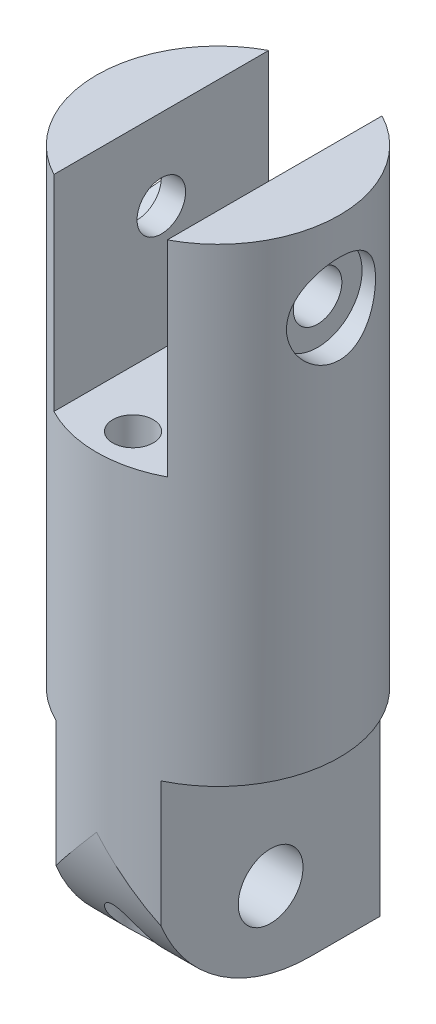
ISO-10303-21;
HEADER;
FILE_DESCRIPTION(('STEP AP214'),'2;1');
FILE_NAME('part.step','',(''),(''),'','','');
FILE_SCHEMA(('AUTOMOTIVE_DESIGN { 1 0 10303 214 1 1 1 1 }'));
ENDSEC;
DATA;
#1=APPLICATION_CONTEXT('core data for automotive mechanical design processes');
#2=APPLICATION_PROTOCOL_DEFINITION('international standard','automotive_design',2000,#1);
#3=PRODUCT_CONTEXT('',#1,'mechanical');
#4=PRODUCT('Part','Part','',(#3));
#5=PRODUCT_RELATED_PRODUCT_CATEGORY('part','',(#4));
#6=PRODUCT_DEFINITION_FORMATION('','',#4);
#7=PRODUCT_DEFINITION_CONTEXT('part definition',#1,'design');
#8=PRODUCT_DEFINITION('design','',#6,#7);
#9=PRODUCT_DEFINITION_SHAPE('','',#8);
#10=(LENGTH_UNIT() NAMED_UNIT(*) SI_UNIT(.MILLI.,.METRE.));
#11=(NAMED_UNIT(*) PLANE_ANGLE_UNIT() SI_UNIT($,.RADIAN.));
#12=(NAMED_UNIT(*) SI_UNIT($,.STERADIAN.) SOLID_ANGLE_UNIT());
#13=UNCERTAINTY_MEASURE_WITH_UNIT(LENGTH_MEASURE(1.E-05),#10,'distance_accuracy_value','');
#14=(GEOMETRIC_REPRESENTATION_CONTEXT(3) GLOBAL_UNCERTAINTY_ASSIGNED_CONTEXT((#13)) GLOBAL_UNIT_ASSIGNED_CONTEXT((#10,
#11,#12)) REPRESENTATION_CONTEXT('',''));
#15=CARTESIAN_POINT('',(0.,0.,0.));
#16=DIRECTION('',(0.,0.,1.));
#17=DIRECTION('',(1.,0.,0.));
#18=AXIS2_PLACEMENT_3D('',#15,#16,#17);
#19=CARTESIAN_POINT('',(3.25,7.,15.));
#20=DIRECTION('',(-1.,0.,0.));
#21=DIRECTION('',(0.,-1.,0.));
#22=AXIS2_PLACEMENT_3D('',#19,#20,#21);
#23=PLANE('',#22);
#24=CARTESIAN_POINT('',(3.25,-2.,7.5));
#25=DIRECTION('',(1.,0.,0.));
#26=DIRECTION('',(0.,1.,0.));
#27=AXIS2_PLACEMENT_3D('',#24,#25,#26);
#28=CIRCLE('',#27,2.);
#29=CARTESIAN_POINT('',(3.25,0.,7.5));
#30=VERTEX_POINT('',#29);
#31=EDGE_CURVE('E362',#30,#30,#28,.T.);
#32=ORIENTED_EDGE('',*,*,#31,.F.);
#33=EDGE_LOOP('',(#32));
#34=FACE_BOUND('',#33,.T.);
#35=DIRECTION('',(0.,1.,0.));
#36=VECTOR('',#35,1.);
#37=CARTESIAN_POINT('',(3.25,-7.,0.740747082702113));
#38=LINE('',#37,#36);
#39=CARTESIAN_POINT('',(3.25,-7.,0.740747082702113));
#40=VERTEX_POINT('',#39);
#41=CARTESIAN_POINT('',(3.25,7.,0.740747082702113));
#42=VERTEX_POINT('',#41);
#43=EDGE_CURVE('E241',#40,#42,#38,.T.);
#44=ORIENTED_EDGE('',*,*,#43,.T.);
#45=DIRECTION('',(0.,0.,-1.));
#46=VECTOR('',#45,1.);
#47=CARTESIAN_POINT('',(3.25,7.,15.));
#48=LINE('',#47,#46);
#49=CARTESIAN_POINT('',(3.25,7.,14.2592529172979));
#50=VERTEX_POINT('',#49);
#51=EDGE_CURVE('E380',#50,#42,#48,.T.);
#52=ORIENTED_EDGE('',*,*,#51,.F.);
#53=DIRECTION('',(0.,1.,0.));
#54=VECTOR('',#53,1.);
#55=CARTESIAN_POINT('',(3.25,-7.,14.2592529172979));
#56=LINE('',#55,#54);
#57=CARTESIAN_POINT('',(3.25,-0.777067038524808,14.2592529172979));
#58=VERTEX_POINT('',#57);
#59=EDGE_CURVE('E250',#58,#50,#56,.T.);
#60=ORIENTED_EDGE('',*,*,#59,.F.);
#61=CARTESIAN_POINT('',(3.25,3.,5.));
#62=DIRECTION('',(-1.,0.,0.));
#63=DIRECTION('',(0.,-1.,0.));
#64=AXIS2_PLACEMENT_3D('',#61,#62,#63);
#65=CIRCLE('',#64,10.);
#66=CARTESIAN_POINT('',(3.25,-7.,5.));
#67=VERTEX_POINT('',#66);
#68=EDGE_CURVE('E383',#58,#67,#65,.F.);
#69=ORIENTED_EDGE('',*,*,#68,.T.);
#70=DIRECTION('',(0.,0.,-1.));
#71=VECTOR('',#70,1.);
#72=CARTESIAN_POINT('',(3.25,-7.,15.));
#73=LINE('',#72,#71);
#74=EDGE_CURVE('E365',#67,#40,#73,.T.);
#75=ORIENTED_EDGE('',*,*,#74,.T.);
#76=EDGE_LOOP('',(#44,#52,#60,#69,#75));
#77=FACE_BOUND('',#76,.T.);
#78=ADVANCED_FACE('F69',(#34,#77),#23,.F.);
#79=CARTESIAN_POINT('',(-3.25,-7.,15.));
#80=DIRECTION('',(0.,1.,0.));
#81=DIRECTION('',(0.,0.,1.));
#82=AXIS2_PLACEMENT_3D('',#79,#80,#81);
#83=PLANE('',#82);
#84=CARTESIAN_POINT('',(0.,-7.,3.));
#85=DIRECTION('',(0.,-1.,0.));
#86=DIRECTION('',(0.,0.,-1.));
#87=AXIS2_PLACEMENT_3D('',#84,#85,#86);
#88=CIRCLE('',#87,1.25);
#89=CARTESIAN_POINT('',(0.,-7.,1.75));
#90=VERTEX_POINT('',#89);
#91=EDGE_CURVE('E650',#90,#90,#88,.T.);
#92=ORIENTED_EDGE('',*,*,#91,.F.);
#93=EDGE_LOOP('',(#92));
#94=FACE_BOUND('',#93,.T.);
#95=CARTESIAN_POINT('',(0.,-7.,7.5));
#96=DIRECTION('',(0.,1.,0.));
#97=DIRECTION('',(0.,0.,1.));
#98=AXIS2_PLACEMENT_3D('',#95,#96,#97);
#99=CIRCLE('',#98,7.5);
#100=CARTESIAN_POINT('',(-3.25,-7.,0.740747082702113));
#101=VERTEX_POINT('',#100);
#102=EDGE_CURVE('E251',#40,#101,#99,.T.);
#103=ORIENTED_EDGE('',*,*,#102,.F.);
#104=ORIENTED_EDGE('',*,*,#74,.F.);
#105=DIRECTION('',(1.,0.,0.));
#106=VECTOR('',#105,1.);
#107=CARTESIAN_POINT('',(-3.25,-7.,5.));
#108=LINE('',#107,#106);
#109=CARTESIAN_POINT('',(-3.25,-7.,5.));
#110=VERTEX_POINT('',#109);
#111=EDGE_CURVE('E385',#67,#110,#108,.F.);
#112=ORIENTED_EDGE('',*,*,#111,.T.);
#113=DIRECTION('',(0.,0.,-1.));
#114=VECTOR('',#113,1.);
#115=CARTESIAN_POINT('',(-3.25,-7.,15.));
#116=LINE('',#115,#114);
#117=EDGE_CURVE('E374',#110,#101,#116,.T.);
#118=ORIENTED_EDGE('',*,*,#117,.T.);
#119=EDGE_LOOP('',(#103,#104,#112,#118));
#120=FACE_BOUND('',#119,.T.);
#121=ADVANCED_FACE('F330',(#94,#120),#83,.F.);
#122=CARTESIAN_POINT('',(-3.25,7.,15.));
#123=DIRECTION('',(1.,0.,0.));
#124=DIRECTION('',(0.,1.,0.));
#125=AXIS2_PLACEMENT_3D('',#122,#123,#124);
#126=PLANE('',#125);
#127=CARTESIAN_POINT('',(-3.25,-2.,7.5));
#128=DIRECTION('',(1.,0.,0.));
#129=DIRECTION('',(0.,1.,0.));
#130=AXIS2_PLACEMENT_3D('',#127,#128,#129);
#131=CIRCLE('',#130,2.);
#132=CARTESIAN_POINT('',(-3.25,0.,7.5));
#133=VERTEX_POINT('',#132);
#134=EDGE_CURVE('E360',#133,#133,#131,.T.);
#135=ORIENTED_EDGE('',*,*,#134,.T.);
#136=EDGE_LOOP('',(#135));
#137=FACE_BOUND('',#136,.T.);
#138=CARTESIAN_POINT('',(-3.25,3.,5.));
#139=DIRECTION('',(1.,0.,0.));
#140=DIRECTION('',(0.,1.,0.));
#141=AXIS2_PLACEMENT_3D('',#138,#139,#140);
#142=CIRCLE('',#141,10.);
#143=CARTESIAN_POINT('',(-3.25,-0.777067038524727,14.2592529172979));
#144=VERTEX_POINT('',#143);
#145=EDGE_CURVE('E387',#110,#144,#142,.F.);
#146=ORIENTED_EDGE('',*,*,#145,.T.);
#147=DIRECTION('',(0.,1.,0.));
#148=VECTOR('',#147,1.);
#149=CARTESIAN_POINT('',(-3.25,-7.,14.2592529172979));
#150=LINE('',#149,#148);
#151=CARTESIAN_POINT('',(-3.25,7.,14.2592529172979));
#152=VERTEX_POINT('',#151);
#153=EDGE_CURVE('E239',#144,#152,#150,.T.);
#154=ORIENTED_EDGE('',*,*,#153,.T.);
#155=DIRECTION('',(0.,0.,-1.));
#156=VECTOR('',#155,1.);
#157=CARTESIAN_POINT('',(-3.25,7.,15.));
#158=LINE('',#157,#156);
#159=CARTESIAN_POINT('',(-3.25,7.,0.740747082702112));
#160=VERTEX_POINT('',#159);
#161=EDGE_CURVE('E377',#152,#160,#158,.T.);
#162=ORIENTED_EDGE('',*,*,#161,.T.);
#163=DIRECTION('',(0.,1.,0.));
#164=VECTOR('',#163,1.);
#165=CARTESIAN_POINT('',(-3.25,-7.,0.740747082702113));
#166=LINE('',#165,#164);
#167=EDGE_CURVE('E413',#101,#160,#166,.T.);
#168=ORIENTED_EDGE('',*,*,#167,.F.);
#169=ORIENTED_EDGE('',*,*,#117,.F.);
#170=EDGE_LOOP('',(#146,#154,#162,#168,#169));
#171=FACE_BOUND('',#170,.T.);
#172=ADVANCED_FACE('F335',(#137,#171),#126,.F.);
#173=CARTESIAN_POINT('',(0.,3.,5.));
#174=DIRECTION('',(-1.,0.,0.));
#175=DIRECTION('',(0.,0.,1.));
#176=AXIS2_PLACEMENT_3D('',#173,#174,#175);
#177=CYLINDRICAL_SURFACE('',#176,10.);
#178=CARTESIAN_POINT('',(0.,-4.60034588039679,11.4988262400479));
#179=CARTESIAN_POINT('',(0.0575288109608131,-4.60034633192946,11.4988256093035));
#180=CARTESIAN_POINT('',(0.11505399772144,-4.59693401826059,11.502822715136));
#181=CARTESIAN_POINT('',(0.22823665096081,-4.5834761227697,11.5185116248287));
#182=CARTESIAN_POINT('',(0.283893883210376,-4.57342971231711,11.5302043899131));
#183=CARTESIAN_POINT('',(0.391522903078539,-4.54727481070758,11.560414189299));
#184=CARTESIAN_POINT('',(0.443509328590721,-4.53119222670741,11.578902052222));
#185=CARTESIAN_POINT('',(0.542970946334787,-4.49367037095389,11.6216094500825));
#186=CARTESIAN_POINT('',(0.590444207603541,-4.47222882047104,11.6458314230352));
#187=CARTESIAN_POINT('',(0.693858382566063,-4.41754856445222,11.7068701017729));
#188=CARTESIAN_POINT('',(0.74800982895763,-4.38270365386441,11.7452795553846));
#189=CARTESIAN_POINT('',(0.847148183723735,-4.30681705487514,11.8274129335695));
#190=CARTESIAN_POINT('',(0.89211987702798,-4.26576527170702,11.8711454925512));
#191=CARTESIAN_POINT('',(0.987252420045894,-4.16367094789748,11.9777470851912));
#192=CARTESIAN_POINT('',(1.03375682534324,-4.10064843319519,12.0419724818224));
#193=CARTESIAN_POINT('',(1.11202550102491,-3.96841120618138,12.1728634669199));
#194=CARTESIAN_POINT('',(1.14376846925352,-3.89918771589937,12.2395324330415));
#195=CARTESIAN_POINT('',(1.20512691121574,-3.72575254744175,12.4015979723462));
#196=CARTESIAN_POINT('',(1.22801220853734,-3.61925054145639,12.4970726247963));
#197=CARTESIAN_POINT('',(1.25192625827192,-3.40072630611675,12.6845018482235));
#198=CARTESIAN_POINT('',(1.25290080853041,-3.28869107409675,12.7764471281507));
#199=CARTESIAN_POINT('',(1.2390160739484,-3.10025953801128,12.9243894094759));
#200=CARTESIAN_POINT('',(1.22941770428853,-3.02467078036612,12.9819973062648));
#201=CARTESIAN_POINT('',(1.20265869273446,-2.87271614168859,13.0944508219831));
#202=CARTESIAN_POINT('',(1.18549447992938,-2.79634991035228,13.1492951229198));
#203=CARTESIAN_POINT('',(1.14397630217485,-2.64352762751517,13.2558626611615));
#204=CARTESIAN_POINT('',(1.1196297934206,-2.56707175066068,13.3075890685247));
#205=CARTESIAN_POINT('',(1.0637867813495,-2.4146576671145,13.4077218470943));
#206=CARTESIAN_POINT('',(1.03229458006037,-2.33869918916016,13.4561301931831));
#207=CARTESIAN_POINT('',(0.959546911817907,-2.18327021358453,13.5523439188718));
#208=CARTESIAN_POINT('',(0.917797461428203,-2.10388405447856,13.5999146411363));
#209=CARTESIAN_POINT('',(0.824662482152894,-1.94813724713139,13.6904545809013));
#210=CARTESIAN_POINT('',(0.773285416874435,-1.87177401232619,13.7334277883316));
#211=CARTESIAN_POINT('',(0.676695759717014,-1.74841146843393,13.8009016608124));
#212=CARTESIAN_POINT('',(0.634678644034613,-1.69976793648386,13.8269441706631));
#213=CARTESIAN_POINT('',(0.543764619578198,-1.60733393640184,13.8755374312719));
#214=CARTESIAN_POINT('',(0.494882481116181,-1.56353340082824,13.8980954657454));
#215=CARTESIAN_POINT('',(0.410328609425263,-1.50057299344001,13.9300362657961));
#216=CARTESIAN_POINT('',(0.377364323238513,-1.47863442485303,13.9410472218018));
#217=CARTESIAN_POINT('',(0.308269866690451,-1.43908401630296,13.9607487164632));
#218=CARTESIAN_POINT('',(0.272144496533989,-1.42146576535685,13.9694426950006));
#219=CARTESIAN_POINT('',(0.204140015054733,-1.39500732552652,13.9824321515032));
#220=CARTESIAN_POINT('',(0.172770922493601,-1.38513258262856,13.9872509335304));
#221=CARTESIAN_POINT('',(0.10863906512088,-1.3702186469195,13.9945127413908));
#222=CARTESIAN_POINT('',(0.0758780804831299,-1.36517346082817,13.9969587118357));
#223=CARTESIAN_POINT('',(0.00971565662024547,-1.36049332526411,13.999228082882));
#224=CARTESIAN_POINT('',(-0.0236880276005255,-1.36088324321488,13.9990394291871));
#225=CARTESIAN_POINT('',(-0.0898697850396133,-1.36708221585887,13.9960326446625));
#226=CARTESIAN_POINT('',(-0.12264736944618,-1.37289534121178,13.9932125386644));
#227=CARTESIAN_POINT('',(-0.192498993484608,-1.39076317365085,13.9845039818664));
#228=CARTESIAN_POINT('',(-0.229268404492208,-1.40376175841571,13.9781502759771));
#229=CARTESIAN_POINT('',(-0.299995279155415,-1.43484740134685,13.9628359879126));
#230=CARTESIAN_POINT('',(-0.333946810007977,-1.45294485968761,13.9538700763329));
#231=CARTESIAN_POINT('',(-0.418925600500643,-1.50503533887645,13.9278178923304));
#232=CARTESIAN_POINT('',(-0.467632638347218,-1.54196424707584,13.909126433341));
#233=CARTESIAN_POINT('',(-0.558564300251688,-1.62136560507975,13.8682014347293));
#234=CARTESIAN_POINT('',(-0.600770050090257,-1.66385355695524,13.8459579501095));
#235=CARTESIAN_POINT('',(-0.678801636651221,-1.75107385940053,13.799413769684));
#236=CARTESIAN_POINT('',(-0.714760353406768,-1.79572378952148,13.7751782289425));
#237=CARTESIAN_POINT('',(-0.782368998157438,-1.88709197799037,13.724624021988));
#238=CARTESIAN_POINT('',(-0.814015009233281,-1.93381206615915,13.6983034959845));
#239=CARTESIAN_POINT('',(-0.873578262146656,-2.02867607236967,13.6438079702081));
#240=CARTESIAN_POINT('',(-0.901487844310031,-2.07682267540891,13.6156293325072));
#241=CARTESIAN_POINT('',(-0.953869165706419,-2.17399414365024,13.5576276254842));
#242=CARTESIAN_POINT('',(-0.978339944562463,-2.22301924990456,13.5278041000089));
#243=CARTESIAN_POINT('',(-1.03648457622005,-2.34837571239289,13.4500224067966));
#244=CARTESIAN_POINT('',(-1.06794492165718,-2.42508593896396,13.4010069487532));
#245=CARTESIAN_POINT('',(-1.12359720816828,-2.57896430130894,13.2996181391025));
#246=CARTESIAN_POINT('',(-1.14778503835172,-2.65613267101885,13.2472429085551));
#247=CARTESIAN_POINT('',(-1.18880186967856,-2.81020378415608,13.1394324196061));
#248=CARTESIAN_POINT('',(-1.2056368062501,-2.8871066919307,13.0839996701717));
#249=CARTESIAN_POINT('',(-1.23159320381571,-3.04008538662955,12.970348311449));
#250=CARTESIAN_POINT('',(-1.2407185329799,-3.11616156941276,12.912131114723));
#251=CARTESIAN_POINT('',(-1.25286792344638,-3.30085753472534,12.766499936122));
#252=CARTESIAN_POINT('',(-1.2513126972625,-3.40875200184953,12.6777134732531));
#253=CARTESIAN_POINT('',(-1.22772366104796,-3.61938148403095,12.4968619169247));
#254=CARTESIAN_POINT('',(-1.20573097558767,-3.72212642360836,12.4048037644697));
#255=CARTESIAN_POINT('',(-1.14743386723128,-3.8900628974733,12.2481774324844));
#256=CARTESIAN_POINT('',(-1.11731814138053,-3.95734634387134,12.1835632594184));
#257=CARTESIAN_POINT('',(-1.04332667285176,-4.0862124112587,12.0564668539613));
#258=CARTESIAN_POINT('',(-0.999468461074937,-4.14780216661484,11.9939820172111));
#259=CARTESIAN_POINT('',(-0.908823343821531,-4.24931724766382,11.8885005866831));
#260=CARTESIAN_POINT('',(-0.865205843162854,-4.2909138401453,11.8444000545688));
#261=CARTESIAN_POINT('',(-0.76883757221327,-4.36814251288804,11.7611894906291));
#262=CARTESIAN_POINT('',(-0.716098431613276,-4.40378207569116,11.7220732130628));
#263=CARTESIAN_POINT('',(-0.612245124736067,-4.46172352984542,11.657643266576));
#264=CARTESIAN_POINT('',(-0.562586109481275,-4.48527243298603,11.6311133106998));
#265=CARTESIAN_POINT('',(-0.458065299417217,-4.52641813587298,11.584375566612));
#266=CARTESIAN_POINT('',(-0.403206475147318,-4.54401830807232,11.5641641967587));
#267=CARTESIAN_POINT('',(-0.291201637526191,-4.57200141151039,11.5318637455773));
#268=CARTESIAN_POINT('',(-0.234168560095787,-4.58257937423715,11.5195555175503));
#269=CARTESIAN_POINT('',(-0.118088610350123,-4.59675024599106,11.5030383998551));
#270=CARTESIAN_POINT('',(-0.0590423964677331,-4.60034541698428,11.4988268873873));
#271=CARTESIAN_POINT('',(0.,-4.60034588039679,11.4988262400479));
#272=B_SPLINE_CURVE_WITH_KNOTS('',3,(#178,#179,#180,#181,#182,#183,#184,#185,#186,#187,#188,
#189,#190,#191,#192,#193,#194,#195,#196,#197,#198,#199,#200,#201,#202,#203,#204,#205,#206,#207,
#208,#209,#210,#211,#212,#213,#214,#215,#216,#217,#218,#219,#220,#221,#222,#223,#224,#225,#226,
#227,#228,#229,#230,#231,#232,#233,#234,#235,#236,#237,#238,#239,#240,#241,#242,#243,#244,#245,
#246,#247,#248,#249,#250,#251,#252,#253,#254,#255,#256,#257,#258,#259,#260,#261,#262,#263,#264,
#265,#266,#267,#268,#269,#270,#271),.UNSPECIFIED.,.T.,.F.,(4,2,2,2,2,2,2,2,2,2,2,2,2,2,2,2,2,2,
2,2,2,2,2,2,2,2,2,2,2,2,2,2,2,2,2,2,2,2,2,2,2,2,2,2,2,2,4),(0.,0.172348273756097,
0.344718078712481,0.516356381687259,0.688067792913604,0.911779782670741,1.13585960792365,
1.43805653794473,1.74068822377861,2.17289589147549,2.60617262432262,2.89241887086686,
3.17880036422053,3.46488559482381,3.75079904413221,4.05491767460736,4.35877019896172,
4.56645367834022,4.77369697735467,4.89669523302743,5.0195098500147,5.11882624455042,
5.21801923115933,5.31766620732977,5.41738803875374,5.53527045520422,5.65339507916606,
5.84407282185146,6.03529410095019,6.22174555510802,6.40836523689131,6.59536181455266,
6.78241051261683,7.07097917352888,7.35971064655029,7.64820861604563,7.93656175026965,
8.35438832069885,8.77137595038052,9.06454630970578,9.35734419210841,9.58060303576063,
9.80357930464446,9.98592361306855,10.1681643728299,10.3451044636672,10.5219872279666),.UNSPECIFIED.);
#273=CARTESIAN_POINT('',(0.,-4.60034588039679,11.4988262400479));
#274=VERTEX_POINT('',#273);
#275=EDGE_CURVE('E206',#274,#274,#272,.T.);
#276=ORIENTED_EDGE('',*,*,#275,.F.);
#277=EDGE_LOOP('',(#276));
#278=FACE_BOUND('',#277,.T.);
#279=CARTESIAN_POINT('',(-3.25,-0.777067038524808,14.2592529172979));
#280=CARTESIAN_POINT('',(-3.11964803441231,-0.623422022657622,14.3219224333858));
#281=CARTESIAN_POINT('',(-2.98826751006328,-0.469006401054278,14.3804577255213));
#282=CARTESIAN_POINT('',(-2.7237404145902,-0.158847919875885,14.4894004376096));
#283=CARTESIAN_POINT('',(-2.59059398915032,-0.00310517016124126,14.539808523586));
#284=CARTESIAN_POINT('',(-2.1888915842863,0.46585242207751,14.6790735815163));
#285=CARTESIAN_POINT('',(-1.91809052694975,0.78077536711749,14.7559627524007));
#286=CARTESIAN_POINT('',(-1.37572389886744,1.4099863558356,14.8779292423823));
#287=CARTESIAN_POINT('',(-1.10419730090432,1.72424533420997,14.9233371711216));
#288=CARTESIAN_POINT('',(-0.5594483269617,2.35399928323636,14.984120133363));
#289=CARTESIAN_POINT('',(-0.286226977240884,2.66949346995055,14.9995118431247));
#290=CARTESIAN_POINT('',(-0.00872869143398145,2.9899209752028,14.9999961890182));
#291=CARTESIAN_POINT('',(-0.00436433249316354,2.9949605028181,14.9999999984407));
#292=CARTESIAN_POINT('',(0.,3.,15.));
#293=B_SPLINE_CURVE_WITH_KNOTS('',3,(#279,#280,#281,#282,#283,#284,#285,#286,#287,#288,#289,
#290,#291,#292),.UNSPECIFIED.,.F.,.F.,(4,2,2,2,2,2,4),(0.,0.632933239584302,1.26581458397719,
2.53166454368447,3.78401078214235,5.03566104994836,5.05566105321367),.UNSPECIFIED.);
#294=CARTESIAN_POINT('',(0.,3.00000000000002,15.));
#295=VERTEX_POINT('',#294);
#296=EDGE_CURVE('E243',#144,#295,#293,.T.);
#297=ORIENTED_EDGE('',*,*,#296,.F.);
#298=ORIENTED_EDGE('',*,*,#145,.F.);
#299=ORIENTED_EDGE('',*,*,#111,.F.);
#300=ORIENTED_EDGE('',*,*,#68,.F.);
#301=CARTESIAN_POINT('',(3.25,-0.777067038524808,14.2592529172979));
#302=CARTESIAN_POINT('',(3.11964803441233,-0.623422022657608,14.3219224333858));
#303=CARTESIAN_POINT('',(2.9882675100633,-0.469006401054276,14.3804577255213));
#304=CARTESIAN_POINT('',(2.7237404145902,-0.158847919875907,14.4894004376096));
#305=CARTESIAN_POINT('',(2.59059398915031,-0.00310517016127368,14.539808523586));
#306=CARTESIAN_POINT('',(2.18889158428635,0.465852422077542,14.6790735815163));
#307=CARTESIAN_POINT('',(1.91809052694998,0.780775367117685,14.7559627524007));
#308=CARTESIAN_POINT('',(1.37572389886721,1.40998635583541,14.8779292423823));
#309=CARTESIAN_POINT('',(1.10419730090346,1.72424533420923,14.9233371711216));
#310=CARTESIAN_POINT('',(0.559448326962563,2.35399928323711,14.984120133363));
#311=CARTESIAN_POINT('',(0.286226977244101,2.66949346995334,14.9995118431247));
#312=CARTESIAN_POINT('',(0.00872869143408389,2.98992097520289,14.9999961890182));
#313=CARTESIAN_POINT('',(0.00436433249321547,2.99496050281815,14.9999999984407));
#314=CARTESIAN_POINT('',(0.,3.,15.));
#315=B_SPLINE_CURVE_WITH_KNOTS('',3,(#301,#302,#303,#304,#305,#306,#307,#308,#309,#310,#311,
#312,#313,#314),.UNSPECIFIED.,.F.,.F.,(4,2,2,2,2,2,4),(0.,0.632933239584291,1.26581458397717,
2.53166454368448,3.78401078214236,5.03566104994837,5.05566105321368),.UNSPECIFIED.);
#316=EDGE_CURVE('E263',#58,#295,#315,.T.);
#317=ORIENTED_EDGE('',*,*,#316,.T.);
#318=EDGE_LOOP('',(#297,#298,#299,#300,#317));
#319=FACE_BOUND('',#318,.T.);
#320=ADVANCED_FACE('F71',(#278,#319),#177,.T.);
#321=CARTESIAN_POINT('',(0.,36.,7.5));
#322=DIRECTION('',(0.,1.,0.));
#323=DIRECTION('',(0.,0.,1.));
#324=AXIS2_PLACEMENT_3D('',#321,#322,#323);
#325=PLANE('',#324);
#326=DIRECTION('',(0.,0.,1.));
#327=VECTOR('',#326,1.);
#328=CARTESIAN_POINT('',(-3.50000000000002,36.,7.5));
#329=LINE('',#328,#327);
#330=CARTESIAN_POINT('',(-3.50000000000002,36.,0.86675041928921));
#331=VERTEX_POINT('',#330);
#332=CARTESIAN_POINT('',(-3.50000000000002,36.,14.1332495807108));
#333=VERTEX_POINT('',#332);
#334=EDGE_CURVE('E391',#331,#333,#329,.T.);
#335=ORIENTED_EDGE('',*,*,#334,.F.);
#336=CARTESIAN_POINT('',(0.,36.,7.5));
#337=DIRECTION('',(0.,1.,0.));
#338=DIRECTION('',(0.,0.,1.));
#339=AXIS2_PLACEMENT_3D('',#336,#337,#338);
#340=CIRCLE('',#339,7.5);
#341=EDGE_CURVE('E368',#331,#333,#340,.T.);
#342=ORIENTED_EDGE('',*,*,#341,.T.);
#343=EDGE_LOOP('',(#335,#342));
#344=FACE_BOUND('',#343,.T.);
#345=ADVANCED_FACE('F346',(#344),#325,.T.);
#346=CARTESIAN_POINT('',(-3.25,-2.,7.5));
#347=DIRECTION('',(1.,0.,0.));
#348=DIRECTION('',(0.,1.,0.));
#349=AXIS2_PLACEMENT_3D('',#346,#347,#348);
#350=CYLINDRICAL_SURFACE('',#349,2.);
#351=ORIENTED_EDGE('',*,*,#134,.F.);
#352=EDGE_LOOP('',(#351));
#353=FACE_BOUND('',#352,.T.);
#354=ORIENTED_EDGE('',*,*,#31,.T.);
#355=EDGE_LOOP('',(#354));
#356=FACE_BOUND('',#355,.T.);
#357=ADVANCED_FACE('F343',(#353,#356),#350,.F.);
#358=CARTESIAN_POINT('',(0.,7.,7.5));
#359=DIRECTION('',(0.,1.,0.));
#360=DIRECTION('',(0.,0.,1.));
#361=AXIS2_PLACEMENT_3D('',#358,#359,#360);
#362=PLANE('',#361);
#363=CARTESIAN_POINT('',(0.,7.,7.5));
#364=DIRECTION('',(0.,1.,0.));
#365=DIRECTION('',(0.,0.,1.));
#366=AXIS2_PLACEMENT_3D('',#363,#364,#365);
#367=CIRCLE('',#366,7.5);
#368=EDGE_CURVE('E423',#50,#42,#367,.T.);
#369=ORIENTED_EDGE('',*,*,#368,.F.);
#370=ORIENTED_EDGE('',*,*,#51,.T.);
#371=EDGE_LOOP('',(#369,#370));
#372=FACE_BOUND('',#371,.T.);
#373=ADVANCED_FACE('F345',(#372),#362,.F.);
#374=CARTESIAN_POINT('',(0.,36.,7.5));
#375=DIRECTION('',(0.,-1.,0.));
#376=DIRECTION('',(0.,0.,-1.));
#377=AXIS2_PLACEMENT_3D('',#374,#375,#376);
#378=CYLINDRICAL_SURFACE('',#377,7.5);
#379=DIRECTION('',(0.,-1.,0.));
#380=VECTOR('',#379,1.);
#381=CARTESIAN_POINT('',(-6.75925291729789,36.,4.25000000000001));
#382=LINE('',#381,#380);
#383=CARTESIAN_POINT('',(-6.7592529172979,29.1236116251337,4.25000000000001));
#384=VERTEX_POINT('',#383);
#385=CARTESIAN_POINT('',(-6.75925291729789,32.8763883748663,4.25000000000001));
#386=VERTEX_POINT('',#385);
#387=EDGE_CURVE('E79',#384,#386,#382,.F.);
#388=ORIENTED_EDGE('',*,*,#387,.T.);
#389=CARTESIAN_POINT('',(0.,34.7527767497326,7.5));
#390=DIRECTION('',(0.,0.866025403784439,-0.499999999999999));
#391=DIRECTION('',(0.,-0.499999999999999,-0.866025403784439));
#392=AXIS2_PLACEMENT_3D('',#389,#390,#391);
#393=ELLIPSE('',#392,8.66025403784438,7.5);
#394=CARTESIAN_POINT('',(-7.5,34.7527767497326,7.5));
#395=VERTEX_POINT('',#394);
#396=EDGE_CURVE('E12',#386,#395,#393,.T.);
#397=ORIENTED_EDGE('',*,*,#396,.T.);
#398=CARTESIAN_POINT('',(0.,34.7527767497326,7.5));
#399=DIRECTION('',(0.,0.866025403784438,0.500000000000001));
#400=DIRECTION('',(0.,-0.500000000000001,0.866025403784438));
#401=AXIS2_PLACEMENT_3D('',#398,#399,#400);
#402=ELLIPSE('',#401,8.66025403784439,7.5);
#403=CARTESIAN_POINT('',(-6.75925291729789,32.8763883748663,10.75));
#404=VERTEX_POINT('',#403);
#405=EDGE_CURVE('E186',#395,#404,#402,.T.);
#406=ORIENTED_EDGE('',*,*,#405,.T.);
#407=DIRECTION('',(0.,-1.,0.));
#408=VECTOR('',#407,1.);
#409=CARTESIAN_POINT('',(-6.75925291729789,36.,10.75));
#410=LINE('',#409,#408);
#411=CARTESIAN_POINT('',(-6.75925291729789,29.1236116251337,10.75));
#412=VERTEX_POINT('',#411);
#413=EDGE_CURVE('E659',#404,#412,#410,.T.);
#414=ORIENTED_EDGE('',*,*,#413,.T.);
#415=CARTESIAN_POINT('',(0.,27.2472232502674,7.5));
#416=DIRECTION('',(0.,-0.866025403784439,0.5));
#417=DIRECTION('',(0.,-0.5,-0.866025403784439));
#418=AXIS2_PLACEMENT_3D('',#415,#416,#417);
#419=ELLIPSE('',#418,8.66025403784438,7.5);
#420=CARTESIAN_POINT('',(-7.5,27.2472232502674,7.5));
#421=VERTEX_POINT('',#420);
#422=EDGE_CURVE('E645',#412,#421,#419,.T.);
#423=ORIENTED_EDGE('',*,*,#422,.T.);
#424=CARTESIAN_POINT('',(0.,27.2472232502674,7.5));
#425=DIRECTION('',(0.,-0.866025403784439,-0.5));
#426=DIRECTION('',(0.,-0.5,0.866025403784439));
#427=AXIS2_PLACEMENT_3D('',#424,#425,#426);
#428=ELLIPSE('',#427,8.66025403784439,7.5);
#429=EDGE_CURVE('E642',#421,#384,#428,.T.);
#430=ORIENTED_EDGE('',*,*,#429,.T.);
#431=EDGE_LOOP('',(#388,#397,#406,#414,#423,#430));
#432=FACE_BOUND('',#431,.T.);
#433=CARTESIAN_POINT('',(7.5,28.25,7.5));
#434=CARTESIAN_POINT('',(7.50000312186943,28.2499957601559,7.64916340091462));
#435=CARTESIAN_POINT('',(7.49551083407196,28.2621745142851,7.79829715261848));
#436=CARTESIAN_POINT('',(7.47803771691332,28.3103807639427,8.09212061063863));
#437=CARTESIAN_POINT('',(7.46505769251259,28.3464059979212,8.23681073701748));
#438=CARTESIAN_POINT('',(7.43200599882739,28.4408685459559,8.51746784637523));
#439=CARTESIAN_POINT('',(7.41194764249896,28.4992638038986,8.65345064275875));
#440=CARTESIAN_POINT('',(7.36674725461798,28.6365998026205,8.91368339201445));
#441=CARTESIAN_POINT('',(7.34160392586795,28.7155457874537,9.03793033913379));
#442=CARTESIAN_POINT('',(7.28769120419502,28.8951165871431,9.2762429222357));
#443=CARTESIAN_POINT('',(7.25882233991119,28.9964330069993,9.38976472910907));
#444=CARTESIAN_POINT('',(7.20121334184221,29.2164002540435,9.59863947514447));
#445=CARTESIAN_POINT('',(7.17247324728629,29.335056036644,9.69398720232952));
#446=CARTESIAN_POINT('',(7.11723192199314,29.5915596285549,9.86719005872892));
#447=CARTESIAN_POINT('',(7.09084889561058,29.7299454567554,9.94428985961204));
#448=CARTESIAN_POINT('',(7.04484932142569,30.0188406266334,10.0738807153727));
#449=CARTESIAN_POINT('',(7.02523020673632,30.1693453424172,10.126381108384));
#450=CARTESIAN_POINT('',(6.99603990329749,30.4719588814006,10.2031578776842));
#451=CARTESIAN_POINT('',(6.98610194555094,30.6237687440343,10.2284685676662));
#452=CARTESIAN_POINT('',(6.97632326042149,30.929781189296,10.2533816996786));
#453=CARTESIAN_POINT('',(6.97647859485257,31.0839828152304,10.2529941686023));
#454=CARTESIAN_POINT('',(6.98655161563675,31.3810789225906,10.2273152463416));
#455=CARTESIAN_POINT('',(6.99591416236741,31.5241180714193,10.2034399938661));
#456=CARTESIAN_POINT('',(7.02242705549906,31.8039973045031,10.1337980138));
#457=CARTESIAN_POINT('',(7.03957852258203,31.9408364935813,10.088028135926));
#458=CARTESIAN_POINT('',(7.08008337610026,32.2073857915592,9.97508832183277));
#459=CARTESIAN_POINT('',(7.10354498086313,32.3369185940038,9.90754043957437));
#460=CARTESIAN_POINT('',(7.15398860670264,32.5832293506763,9.75322516181072));
#461=CARTESIAN_POINT('',(7.18097180350953,32.7000030210703,9.66645134069005));
#462=CARTESIAN_POINT('',(7.23752687525343,32.9253454837079,9.46960155284458));
#463=CARTESIAN_POINT('',(7.26715387777086,33.032910199767,9.35838932735392));
#464=CARTESIAN_POINT('',(7.32416772152515,33.2281537541427,9.11915779399269));
#465=CARTESIAN_POINT('',(7.3515542477326,33.3158297990106,8.99113612914646));
#466=CARTESIAN_POINT('',(7.40150404263883,33.469849921192,8.71944943250202));
#467=CARTESIAN_POINT('',(7.42399328235867,33.5358733353786,8.57558804380358));
#468=CARTESIAN_POINT('',(7.46106828194135,33.6424524315738,8.27777168193606));
#469=CARTESIAN_POINT('',(7.47565739110895,33.6830189073552,8.12382101725383));
#470=CARTESIAN_POINT('',(7.49470661210037,33.7356341007007,7.81865715690413));
#471=CARTESIAN_POINT('',(7.49964681722227,33.7490358318725,7.66770697278252));
#472=CARTESIAN_POINT('',(7.50031608885126,33.7508630018728,7.36565203255629));
#473=CARTESIAN_POINT('',(7.49604709187873,33.7392936916369,7.21454731562548));
#474=CARTESIAN_POINT('',(7.47909471176213,33.6925452079771,6.92222898460096));
#475=CARTESIAN_POINT('',(7.46672323625137,33.6582406720004,6.7808555379685));
#476=CARTESIAN_POINT('',(7.43512235809386,33.5681349472647,6.50596090832168));
#477=CARTESIAN_POINT('',(7.41589206317618,33.5123309615443,6.37244074958353));
#478=CARTESIAN_POINT('',(7.3717934654489,33.3790539116285,6.11272893005816));
#479=CARTESIAN_POINT('',(7.34677844528394,33.301001869951,5.98686004951381));
#480=CARTESIAN_POINT('',(7.29389308718916,33.1261036082178,5.74959324541106));
#481=CARTESIAN_POINT('',(7.26602173076095,33.0292506731475,5.63820051602461));
#482=CARTESIAN_POINT('',(7.20858443222809,32.813177374235,5.42659777286201));
#483=CARTESIAN_POINT('',(7.17901017230758,32.6930149402375,5.32734951094925));
#484=CARTESIAN_POINT('',(7.12301420495134,32.4371450050785,5.15025082554627));
#485=CARTESIAN_POINT('',(7.09659271654603,32.3014364251721,5.07240188822809));
#486=CARTESIAN_POINT('',(7.05004267507774,32.0174626284658,4.94034362890839));
#487=CARTESIAN_POINT('',(7.02993081583834,31.8691653988561,4.88619687043256));
#488=CARTESIAN_POINT('',(6.99881623412452,31.564621151899,4.80397675168701));
#489=CARTESIAN_POINT('',(6.98780821140261,31.4083788165147,4.77588821917411));
#490=CARTESIAN_POINT('',(6.97683139543633,31.1027486399612,4.74790483037546));
#491=CARTESIAN_POINT('',(6.97622414135252,30.9535317080346,4.74637927832575));
#492=CARTESIAN_POINT('',(6.98449276936025,30.6570884497829,4.76742136880885));
#493=CARTESIAN_POINT('',(6.99336783146823,30.5098619524497,4.789986928062));
#494=CARTESIAN_POINT('',(7.01908063198066,30.225730914034,4.85732302895733));
#495=CARTESIAN_POINT('',(7.03568945153917,30.0886530299248,4.90145689764079));
#496=CARTESIAN_POINT('',(7.0748745278557,29.8237608470382,5.01012643456598));
#497=CARTESIAN_POINT('',(7.09745226019147,29.695948848854,5.07466714836784));
#498=CARTESIAN_POINT('',(7.14745651289183,29.446173516875,5.22612146257841));
#499=CARTESIAN_POINT('',(7.17507087475862,29.3248355716804,5.31400373788159));
#500=CARTESIAN_POINT('',(7.23136315938062,29.0981067555171,5.50811900047636));
#501=CARTESIAN_POINT('',(7.26004141030265,28.9927208569003,5.61435768756782));
#502=CARTESIAN_POINT('',(7.31698041886032,28.7954400202964,5.84862840053257));
#503=CARTESIAN_POINT('',(7.34514593066589,28.7045025963147,5.97749345971985));
#504=CARTESIAN_POINT('',(7.39633669940812,28.5456226545033,6.24965784854994));
#505=CARTESIAN_POINT('',(7.41936193536523,28.4776802305249,6.39295723710164));
#506=CARTESIAN_POINT('',(7.45811714803401,28.3658300233738,6.69376598407588));
#507=CARTESIAN_POINT('',(7.4736521370045,28.3225597743705,6.85153953395494));
#508=CARTESIAN_POINT('',(7.49458959004745,28.2646534781244,7.17288901781912));
#509=CARTESIAN_POINT('',(7.4999965772887,28.2500046484207,7.336462328356));
#510=CARTESIAN_POINT('',(7.5,28.25,7.5));
#511=B_SPLINE_CURVE_WITH_KNOTS('',3,(#433,#434,#435,#436,#437,#438,#439,#440,#441,#442,#443,
#444,#445,#446,#447,#448,#449,#450,#451,#452,#453,#454,#455,#456,#457,#458,#459,#460,#461,#462,
#463,#464,#465,#466,#467,#468,#469,#470,#471,#472,#473,#474,#475,#476,#477,#478,#479,#480,#481,
#482,#483,#484,#485,#486,#487,#488,#489,#490,#491,#492,#493,#494,#495,#496,#497,#498,#499,#500,
#501,#502,#503,#504,#505,#506,#507,#508,#509,#510),.UNSPECIFIED.,.T.,.F.,(4,2,2,2,2,2,2,2,2,2,2,
2,2,2,2,2,2,2,2,2,2,2,2,2,2,2,2,2,2,2,2,2,2,2,2,2,2,2,4),(0.,0.446887269349349,
0.893732162923371,1.33974106914939,1.7858638979375,2.24842473965862,2.71111803601497,
3.19050672893151,3.6697132943022,4.12996375453753,4.59003463599781,5.02396705194619,
5.45796192255757,5.89993527296308,6.34205656133037,6.81248619551747,7.28298186270095,
7.76015995462979,8.23713558552159,8.68970480563612,9.14217886831116,9.57818454876607,
10.0142469703521,10.462896209775,10.9117059866708,11.385386450699,11.8590998032843,
12.3340561236824,12.80873572978,13.254164536792,13.6995548284528,14.13252653843,
14.5656053837986,15.020648736522,15.4758336382825,15.9541458857872,16.4324600854427,
16.9226310274791,17.4125830067758),.UNSPECIFIED.);
#512=CARTESIAN_POINT('',(7.5,28.25,7.5));
#513=VERTEX_POINT('',#512);
#514=EDGE_CURVE('E275',#513,#513,#511,.T.);
#515=ORIENTED_EDGE('',*,*,#514,.T.);
#516=EDGE_LOOP('',(#515));
#517=FACE_BOUND('',#516,.T.);
#518=DIRECTION('',(0.,-1.,0.));
#519=VECTOR('',#518,1.);
#520=CARTESIAN_POINT('',(3.50000000000002,36.,14.1332495807108));
#521=LINE('',#520,#519);
#522=CARTESIAN_POINT('',(3.50000000000002,36.,14.1332495807108));
#523=VERTEX_POINT('',#522);
#524=CARTESIAN_POINT('',(3.49999999999998,23.32,14.1332495807108));
#525=VERTEX_POINT('',#524);
#526=EDGE_CURVE('E95',#523,#525,#521,.T.);
#527=ORIENTED_EDGE('',*,*,#526,.T.);
#528=CARTESIAN_POINT('',(0.,23.32,7.5));
#529=DIRECTION('',(0.,-1.,0.));
#530=DIRECTION('',(0.,0.,-1.));
#531=AXIS2_PLACEMENT_3D('',#528,#529,#530);
#532=CIRCLE('',#531,7.5);
#533=CARTESIAN_POINT('',(-3.50000000000002,23.32,14.1332495807108));
#534=VERTEX_POINT('',#533);
#535=EDGE_CURVE('E270',#525,#534,#532,.T.);
#536=ORIENTED_EDGE('',*,*,#535,.T.);
#537=DIRECTION('',(0.,-1.,0.));
#538=VECTOR('',#537,1.);
#539=CARTESIAN_POINT('',(-3.50000000000002,36.,14.1332495807108));
#540=LINE('',#539,#538);
#541=EDGE_CURVE('E402',#534,#333,#540,.F.);
#542=ORIENTED_EDGE('',*,*,#541,.T.);
#543=ORIENTED_EDGE('',*,*,#341,.F.);
#544=DIRECTION('',(0.,-1.,0.));
#545=VECTOR('',#544,1.);
#546=CARTESIAN_POINT('',(-3.50000000000002,36.,0.866750419289211));
#547=LINE('',#546,#545);
#548=CARTESIAN_POINT('',(-3.50000000000002,23.32,0.866750419289211));
#549=VERTEX_POINT('',#548);
#550=EDGE_CURVE('E421',#331,#549,#547,.T.);
#551=ORIENTED_EDGE('',*,*,#550,.T.);
#552=CARTESIAN_POINT('',(3.49999999999998,23.32,0.86675041928921));
#553=VERTEX_POINT('',#552);
#554=EDGE_CURVE('E271',#549,#553,#532,.T.);
#555=ORIENTED_EDGE('',*,*,#554,.T.);
#556=DIRECTION('',(0.,-1.,0.));
#557=VECTOR('',#556,1.);
#558=CARTESIAN_POINT('',(3.50000000000002,36.,0.866750419289211));
#559=LINE('',#558,#557);
#560=CARTESIAN_POINT('',(3.50000000000002,36.,0.86675041928921));
#561=VERTEX_POINT('',#560);
#562=EDGE_CURVE('E412',#553,#561,#559,.F.);
#563=ORIENTED_EDGE('',*,*,#562,.T.);
#564=EDGE_CURVE('E363',#523,#561,#340,.T.);
#565=ORIENTED_EDGE('',*,*,#564,.F.);
#566=EDGE_LOOP('',(#527,#536,#542,#543,#551,#555,#563,#565));
#567=FACE_BOUND('',#566,.T.);
#568=EDGE_CURVE('E422',#160,#152,#367,.T.);
#569=ORIENTED_EDGE('',*,*,#568,.T.);
#570=ORIENTED_EDGE('',*,*,#153,.F.);
#571=ORIENTED_EDGE('',*,*,#296,.T.);
#572=ORIENTED_EDGE('',*,*,#316,.F.);
#573=ORIENTED_EDGE('',*,*,#59,.T.);
#574=ORIENTED_EDGE('',*,*,#368,.T.);
#575=ORIENTED_EDGE('',*,*,#43,.F.);
#576=ORIENTED_EDGE('',*,*,#102,.T.);
#577=ORIENTED_EDGE('',*,*,#167,.T.);
#578=EDGE_LOOP('',(#569,#570,#571,#572,#573,#574,#575,#576,#577));
#579=FACE_BOUND('',#578,.T.);
#580=ADVANCED_FACE('F284',(#432,#517,#567,#579),#378,.T.);
#581=DIRECTION('',(0.,0.,-1.));
#582=VECTOR('',#581,1.);
#583=CARTESIAN_POINT('',(3.50000000000002,36.,7.5));
#584=LINE('',#583,#582);
#585=EDGE_CURVE('E390',#523,#561,#584,.T.);
#586=ORIENTED_EDGE('',*,*,#585,.F.);
#587=ORIENTED_EDGE('',*,*,#564,.T.);
#588=EDGE_LOOP('',(#586,#587));
#589=FACE_BOUND('',#588,.T.);
#590=ADVANCED_FACE('F356',(#589),#325,.T.);
#591=ORIENTED_EDGE('',*,*,#161,.F.);
#592=ORIENTED_EDGE('',*,*,#568,.F.);
#593=EDGE_LOOP('',(#591,#592));
#594=FACE_BOUND('',#593,.T.);
#595=ADVANCED_FACE('F353',(#594),#362,.F.);
#596=CARTESIAN_POINT('',(-3.50000000000002,23.32,15.));
#597=DIRECTION('',(0.,-1.,0.));
#598=DIRECTION('',(0.,0.,-1.));
#599=AXIS2_PLACEMENT_3D('',#596,#597,#598);
#600=PLANE('',#599);
#601=CARTESIAN_POINT('',(0.,23.32,12.7488262400479));
#602=DIRECTION('',(0.,-1.,0.));
#603=DIRECTION('',(0.,0.,-1.));
#604=AXIS2_PLACEMENT_3D('',#601,#602,#603);
#605=CIRCLE('',#604,1.25);
#606=CARTESIAN_POINT('',(0.,23.32,11.4988262400479));
#607=VERTEX_POINT('',#606);
#608=EDGE_CURVE('E74',#607,#607,#605,.T.);
#609=ORIENTED_EDGE('',*,*,#608,.T.);
#610=EDGE_LOOP('',(#609));
#611=FACE_BOUND('',#610,.T.);
#612=CARTESIAN_POINT('',(0.,23.32,3.));
#613=DIRECTION('',(0.,-1.,0.));
#614=DIRECTION('',(0.,0.,-1.));
#615=AXIS2_PLACEMENT_3D('',#612,#613,#614);
#616=CIRCLE('',#615,1.25);
#617=CARTESIAN_POINT('',(0.,23.32,1.75));
#618=VERTEX_POINT('',#617);
#619=EDGE_CURVE('E648',#618,#618,#616,.T.);
#620=ORIENTED_EDGE('',*,*,#619,.T.);
#621=EDGE_LOOP('',(#620));
#622=FACE_BOUND('',#621,.T.);
#623=DIRECTION('',(0.,0.,-1.));
#624=VECTOR('',#623,1.);
#625=CARTESIAN_POINT('',(3.49999999999998,23.32,15.));
#626=LINE('',#625,#624);
#627=EDGE_CURVE('E408',#525,#553,#626,.T.);
#628=ORIENTED_EDGE('',*,*,#627,.T.);
#629=ORIENTED_EDGE('',*,*,#554,.F.);
#630=DIRECTION('',(0.,0.,-1.));
#631=VECTOR('',#630,1.);
#632=CARTESIAN_POINT('',(-3.50000000000002,23.32,15.));
#633=LINE('',#632,#631);
#634=EDGE_CURVE('E410',#534,#549,#633,.T.);
#635=ORIENTED_EDGE('',*,*,#634,.F.);
#636=ORIENTED_EDGE('',*,*,#535,.F.);
#637=EDGE_LOOP('',(#628,#629,#635,#636));
#638=FACE_BOUND('',#637,.T.);
#639=ADVANCED_FACE('F260',(#611,#622,#638),#600,.F.);
#640=CARTESIAN_POINT('',(-3.50000000000002,36.,15.));
#641=DIRECTION('',(-1.,0.,0.));
#642=DIRECTION('',(0.,-1.,0.));
#643=AXIS2_PLACEMENT_3D('',#640,#641,#642);
#644=PLANE('',#643);
#645=CARTESIAN_POINT('',(-3.50000000000002,31.,7.5));
#646=DIRECTION('',(-1.,0.,0.));
#647=DIRECTION('',(0.,-1.,0.));
#648=AXIS2_PLACEMENT_3D('',#645,#646,#647);
#649=CIRCLE('',#648,1.5);
#650=CARTESIAN_POINT('',(-3.50000000000002,29.5,7.5));
#651=VERTEX_POINT('',#650);
#652=EDGE_CURVE('E236',#651,#651,#649,.T.);
#653=ORIENTED_EDGE('',*,*,#652,.T.);
#654=EDGE_LOOP('',(#653));
#655=FACE_BOUND('',#654,.T.);
#656=ORIENTED_EDGE('',*,*,#334,.T.);
#657=ORIENTED_EDGE('',*,*,#541,.F.);
#658=ORIENTED_EDGE('',*,*,#634,.T.);
#659=ORIENTED_EDGE('',*,*,#550,.F.);
#660=EDGE_LOOP('',(#656,#657,#658,#659));
#661=FACE_BOUND('',#660,.T.);
#662=ADVANCED_FACE('F448',(#655,#661),#644,.F.);
#663=CARTESIAN_POINT('',(3.50000000000002,36.,15.));
#664=DIRECTION('',(1.,0.,0.));
#665=DIRECTION('',(0.,1.,0.));
#666=AXIS2_PLACEMENT_3D('',#663,#664,#665);
#667=PLANE('',#666);
#668=CARTESIAN_POINT('',(3.5,31.,7.5));
#669=DIRECTION('',(1.,0.,0.));
#670=DIRECTION('',(0.,1.,0.));
#671=AXIS2_PLACEMENT_3D('',#668,#669,#670);
#672=CIRCLE('',#671,1.5);
#673=CARTESIAN_POINT('',(3.50000000000001,32.5,7.5));
#674=VERTEX_POINT('',#673);
#675=EDGE_CURVE('E240',#674,#674,#672,.T.);
#676=ORIENTED_EDGE('',*,*,#675,.T.);
#677=EDGE_LOOP('',(#676));
#678=FACE_BOUND('',#677,.T.);
#679=ORIENTED_EDGE('',*,*,#585,.T.);
#680=ORIENTED_EDGE('',*,*,#562,.F.);
#681=ORIENTED_EDGE('',*,*,#627,.F.);
#682=ORIENTED_EDGE('',*,*,#526,.F.);
#683=EDGE_LOOP('',(#679,#680,#681,#682));
#684=FACE_BOUND('',#683,.T.);
#685=ADVANCED_FACE('F411',(#678,#684),#667,.F.);
#686=CARTESIAN_POINT('',(-24.5,31.,7.5));
#687=DIRECTION('',(1.,0.,0.));
#688=DIRECTION('',(0.,1.,0.));
#689=AXIS2_PLACEMENT_3D('',#686,#687,#688);
#690=CYLINDRICAL_SURFACE('',#689,1.5);
#691=CARTESIAN_POINT('',(6.14999999999992,31.,7.5));
#692=DIRECTION('',(-1.,0.,0.));
#693=DIRECTION('',(0.,-1.,0.));
#694=AXIS2_PLACEMENT_3D('',#691,#692,#693);
#695=CIRCLE('',#694,1.5);
#696=CARTESIAN_POINT('',(6.14999999999992,29.5,7.5));
#697=VERTEX_POINT('',#696);
#698=EDGE_CURVE('E235',#697,#697,#695,.F.);
#699=ORIENTED_EDGE('',*,*,#698,.T.);
#700=EDGE_LOOP('',(#699));
#701=FACE_BOUND('',#700,.T.);
#702=ORIENTED_EDGE('',*,*,#675,.F.);
#703=EDGE_LOOP('',(#702));
#704=FACE_BOUND('',#703,.T.);
#705=ADVANCED_FACE('F455',(#701,#704),#690,.F.);
#706=CARTESIAN_POINT('',(-5.00000000000002,31.,7.5));
#707=DIRECTION('',(1.,0.,0.));
#708=DIRECTION('',(0.,0.,-1.));
#709=AXIS2_PLACEMENT_3D('',#706,#707,#708);
#710=CIRCLE('',#709,1.5);
#711=CARTESIAN_POINT('',(-5.00000000000002,31.,6.));
#712=VERTEX_POINT('',#711);
#713=EDGE_CURVE('E224',#712,#712,#710,.F.);
#714=ORIENTED_EDGE('',*,*,#713,.T.);
#715=EDGE_LOOP('',(#714));
#716=FACE_BOUND('',#715,.T.);
#717=ORIENTED_EDGE('',*,*,#652,.F.);
#718=EDGE_LOOP('',(#717));
#719=FACE_BOUND('',#718,.T.);
#720=ADVANCED_FACE('F256',(#716,#719),#690,.F.);
#721=CARTESIAN_POINT('',(16.1499999999999,31.,7.5));
#722=DIRECTION('',(-1.,0.,0.));
#723=DIRECTION('',(0.,-1.,0.));
#724=AXIS2_PLACEMENT_3D('',#721,#722,#723);
#725=CYLINDRICAL_SURFACE('',#724,2.75);
#726=CARTESIAN_POINT('',(6.14999999999992,31.,7.5));
#727=DIRECTION('',(-1.,0.,0.));
#728=DIRECTION('',(0.,-1.,0.));
#729=AXIS2_PLACEMENT_3D('',#726,#727,#728);
#730=CIRCLE('',#729,2.75);
#731=CARTESIAN_POINT('',(6.14999999999992,28.25,7.5));
#732=VERTEX_POINT('',#731);
#733=EDGE_CURVE('E232',#732,#732,#730,.T.);
#734=ORIENTED_EDGE('',*,*,#733,.T.);
#735=EDGE_LOOP('',(#734));
#736=FACE_BOUND('',#735,.T.);
#737=ORIENTED_EDGE('',*,*,#514,.F.);
#738=EDGE_LOOP('',(#737));
#739=FACE_BOUND('',#738,.T.);
#740=ADVANCED_FACE('F288',(#736,#739),#725,.F.);
#741=CARTESIAN_POINT('',(6.14999999999992,31.,7.5));
#742=DIRECTION('',(-1.,0.,0.));
#743=DIRECTION('',(0.,-1.,0.));
#744=AXIS2_PLACEMENT_3D('',#741,#742,#743);
#745=PLANE('',#744);
#746=ORIENTED_EDGE('',*,*,#733,.F.);
#747=EDGE_LOOP('',(#746));
#748=FACE_BOUND('',#747,.T.);
#749=ORIENTED_EDGE('',*,*,#698,.F.);
#750=EDGE_LOOP('',(#749));
#751=FACE_BOUND('',#750,.T.);
#752=ADVANCED_FACE('F292',(#748,#751),#745,.F.);
#753=CARTESIAN_POINT('',(-15.,32.8763883748663,4.25000000000001));
#754=DIRECTION('',(0.,0.866025403784439,-0.499999999999999));
#755=DIRECTION('',(0.,0.499999999999999,0.866025403784439));
#756=AXIS2_PLACEMENT_3D('',#753,#754,#755);
#757=PLANE('',#756);
#758=DIRECTION('',(1.,0.,0.));
#759=VECTOR('',#758,1.);
#760=CARTESIAN_POINT('',(-15.,32.8763883748663,4.25000000000001));
#761=LINE('',#760,#759);
#762=CARTESIAN_POINT('',(-5.00000000000002,32.8763883748663,4.25000000000001));
#763=VERTEX_POINT('',#762);
#764=EDGE_CURVE('E205',#386,#763,#761,.T.);
#765=ORIENTED_EDGE('',*,*,#764,.T.);
#766=DIRECTION('',(0.,0.499999999999999,0.866025403784439));
#767=VECTOR('',#766,1.);
#768=CARTESIAN_POINT('',(-5.00000000000002,32.8763883748663,4.25000000000001));
#769=LINE('',#768,#767);
#770=CARTESIAN_POINT('',(-5.00000000000002,34.7527767497326,7.5));
#771=VERTEX_POINT('',#770);
#772=EDGE_CURVE('E197',#763,#771,#769,.T.);
#773=ORIENTED_EDGE('',*,*,#772,.T.);
#774=DIRECTION('',(1.,0.,0.));
#775=VECTOR('',#774,1.);
#776=CARTESIAN_POINT('',(-15.,34.7527767497326,7.5));
#777=LINE('',#776,#775);
#778=EDGE_CURVE('E181',#395,#771,#777,.T.);
#779=ORIENTED_EDGE('',*,*,#778,.F.);
#780=ORIENTED_EDGE('',*,*,#396,.F.);
#781=EDGE_LOOP('',(#765,#773,#779,#780));
#782=FACE_BOUND('',#781,.T.);
#783=ADVANCED_FACE('F203',(#782),#757,.F.);
#784=CARTESIAN_POINT('',(-15.,29.1236116251337,4.25000000000001));
#785=DIRECTION('',(0.,0.,-1.));
#786=DIRECTION('',(0.,1.,0.));
#787=AXIS2_PLACEMENT_3D('',#784,#785,#786);
#788=PLANE('',#787);
#789=DIRECTION('',(1.,0.,0.));
#790=VECTOR('',#789,1.);
#791=CARTESIAN_POINT('',(-15.,29.1236116251337,4.25000000000001));
#792=LINE('',#791,#790);
#793=CARTESIAN_POINT('',(-5.00000000000002,29.1236116251337,4.25000000000001));
#794=VERTEX_POINT('',#793);
#795=EDGE_CURVE('E225',#384,#794,#792,.T.);
#796=ORIENTED_EDGE('',*,*,#795,.T.);
#797=DIRECTION('',(0.,1.,0.));
#798=VECTOR('',#797,1.);
#799=CARTESIAN_POINT('',(-5.00000000000002,29.1236116251337,4.25000000000001));
#800=LINE('',#799,#798);
#801=EDGE_CURVE('E189',#794,#763,#800,.T.);
#802=ORIENTED_EDGE('',*,*,#801,.T.);
#803=ORIENTED_EDGE('',*,*,#764,.F.);
#804=ORIENTED_EDGE('',*,*,#387,.F.);
#805=EDGE_LOOP('',(#796,#802,#803,#804));
#806=FACE_BOUND('',#805,.T.);
#807=ADVANCED_FACE('F299',(#806),#788,.F.);
#808=CARTESIAN_POINT('',(-15.,27.2472232502674,7.5));
#809=DIRECTION('',(0.,-0.866025403784439,-0.5));
#810=DIRECTION('',(0.,0.5,-0.866025403784439));
#811=AXIS2_PLACEMENT_3D('',#808,#809,#810);
#812=PLANE('',#811);
#813=DIRECTION('',(1.,0.,0.));
#814=VECTOR('',#813,1.);
#815=CARTESIAN_POINT('',(-15.,27.2472232502674,7.5));
#816=LINE('',#815,#814);
#817=CARTESIAN_POINT('',(-5.00000000000002,27.2472232502674,7.5));
#818=VERTEX_POINT('',#817);
#819=EDGE_CURVE('E227',#421,#818,#816,.T.);
#820=ORIENTED_EDGE('',*,*,#819,.T.);
#821=DIRECTION('',(0.,0.5,-0.866025403784439));
#822=VECTOR('',#821,1.);
#823=CARTESIAN_POINT('',(-5.00000000000002,27.2472232502674,7.5));
#824=LINE('',#823,#822);
#825=EDGE_CURVE('E219',#818,#794,#824,.T.);
#826=ORIENTED_EDGE('',*,*,#825,.T.);
#827=ORIENTED_EDGE('',*,*,#795,.F.);
#828=ORIENTED_EDGE('',*,*,#429,.F.);
#829=EDGE_LOOP('',(#820,#826,#827,#828));
#830=FACE_BOUND('',#829,.T.);
#831=ADVANCED_FACE('F309',(#830),#812,.F.);
#832=CARTESIAN_POINT('',(-15.,29.1236116251337,10.75));
#833=DIRECTION('',(0.,-0.866025403784439,0.5));
#834=DIRECTION('',(0.,-0.5,-0.866025403784439));
#835=AXIS2_PLACEMENT_3D('',#832,#833,#834);
#836=PLANE('',#835);
#837=DIRECTION('',(1.,0.,0.));
#838=VECTOR('',#837,1.);
#839=CARTESIAN_POINT('',(-15.,29.1236116251337,10.75));
#840=LINE('',#839,#838);
#841=CARTESIAN_POINT('',(-5.00000000000002,29.1236116251337,10.75));
#842=VERTEX_POINT('',#841);
#843=EDGE_CURVE('E229',#412,#842,#840,.T.);
#844=ORIENTED_EDGE('',*,*,#843,.T.);
#845=DIRECTION('',(0.,-0.5,-0.866025403784439));
#846=VECTOR('',#845,1.);
#847=CARTESIAN_POINT('',(-5.00000000000002,29.1236116251337,10.75));
#848=LINE('',#847,#846);
#849=EDGE_CURVE('E216',#842,#818,#848,.T.);
#850=ORIENTED_EDGE('',*,*,#849,.T.);
#851=ORIENTED_EDGE('',*,*,#819,.F.);
#852=ORIENTED_EDGE('',*,*,#422,.F.);
#853=EDGE_LOOP('',(#844,#850,#851,#852));
#854=FACE_BOUND('',#853,.T.);
#855=ADVANCED_FACE('F305',(#854),#836,.F.);
#856=CARTESIAN_POINT('',(-15.,32.8763883748663,10.75));
#857=DIRECTION('',(0.,0.,1.));
#858=DIRECTION('',(1.,0.,0.));
#859=AXIS2_PLACEMENT_3D('',#856,#857,#858);
#860=PLANE('',#859);
#861=DIRECTION('',(1.,0.,0.));
#862=VECTOR('',#861,1.);
#863=CARTESIAN_POINT('',(-15.,32.8763883748663,10.75));
#864=LINE('',#863,#862);
#865=CARTESIAN_POINT('',(-5.00000000000002,32.8763883748663,10.75));
#866=VERTEX_POINT('',#865);
#867=EDGE_CURVE('E87',#404,#866,#864,.T.);
#868=ORIENTED_EDGE('',*,*,#867,.T.);
#869=DIRECTION('',(0.,-1.,0.));
#870=VECTOR('',#869,1.);
#871=CARTESIAN_POINT('',(-5.00000000000002,32.8763883748663,10.75));
#872=LINE('',#871,#870);
#873=EDGE_CURVE('E201',#866,#842,#872,.T.);
#874=ORIENTED_EDGE('',*,*,#873,.T.);
#875=ORIENTED_EDGE('',*,*,#843,.F.);
#876=ORIENTED_EDGE('',*,*,#413,.F.);
#877=EDGE_LOOP('',(#868,#874,#875,#876));
#878=FACE_BOUND('',#877,.T.);
#879=ADVANCED_FACE('F302',(#878),#860,.F.);
#880=CARTESIAN_POINT('',(-15.,34.7527767497326,7.5));
#881=DIRECTION('',(0.,0.866025403784438,0.500000000000001));
#882=DIRECTION('',(0.,-0.500000000000001,0.866025403784438));
#883=AXIS2_PLACEMENT_3D('',#880,#881,#882);
#884=PLANE('',#883);
#885=ORIENTED_EDGE('',*,*,#778,.T.);
#886=DIRECTION('',(0.,-0.500000000000001,0.866025403784438));
#887=VECTOR('',#886,1.);
#888=CARTESIAN_POINT('',(-5.00000000000002,34.7527767497326,7.5));
#889=LINE('',#888,#887);
#890=EDGE_CURVE('E184',#771,#866,#889,.T.);
#891=ORIENTED_EDGE('',*,*,#890,.T.);
#892=ORIENTED_EDGE('',*,*,#867,.F.);
#893=ORIENTED_EDGE('',*,*,#405,.F.);
#894=EDGE_LOOP('',(#885,#891,#892,#893));
#895=FACE_BOUND('',#894,.T.);
#896=ADVANCED_FACE('F183',(#895),#884,.F.);
#897=CARTESIAN_POINT('',(-5.00000000000002,0.,0.));
#898=DIRECTION('',(1.,0.,0.));
#899=DIRECTION('',(0.,0.,-1.));
#900=AXIS2_PLACEMENT_3D('',#897,#898,#899);
#901=PLANE('',#900);
#902=ORIENTED_EDGE('',*,*,#772,.F.);
#903=ORIENTED_EDGE('',*,*,#801,.F.);
#904=ORIENTED_EDGE('',*,*,#825,.F.);
#905=ORIENTED_EDGE('',*,*,#849,.F.);
#906=ORIENTED_EDGE('',*,*,#873,.F.);
#907=ORIENTED_EDGE('',*,*,#890,.F.);
#908=EDGE_LOOP('',(#902,#903,#904,#905,#906,#907));
#909=FACE_BOUND('',#908,.T.);
#910=ORIENTED_EDGE('',*,*,#713,.F.);
#911=EDGE_LOOP('',(#910));
#912=FACE_BOUND('',#911,.T.);
#913=ADVANCED_FACE('F194',(#909,#912),#901,.F.);
#914=CARTESIAN_POINT('',(0.,33.,3.));
#915=DIRECTION('',(0.,-1.,0.));
#916=DIRECTION('',(0.,0.,-1.));
#917=AXIS2_PLACEMENT_3D('',#914,#915,#916);
#918=CYLINDRICAL_SURFACE('',#917,1.25);
#919=ORIENTED_EDGE('',*,*,#91,.T.);
#920=EDGE_LOOP('',(#919));
#921=FACE_BOUND('',#920,.T.);
#922=ORIENTED_EDGE('',*,*,#619,.F.);
#923=EDGE_LOOP('',(#922));
#924=FACE_BOUND('',#923,.T.);
#925=ADVANCED_FACE('F319',(#921,#924),#918,.F.);
#926=CARTESIAN_POINT('',(0.,33.,12.7488262400479));
#927=DIRECTION('',(0.,-1.,0.));
#928=DIRECTION('',(0.,0.,-1.));
#929=AXIS2_PLACEMENT_3D('',#926,#927,#928);
#930=CYLINDRICAL_SURFACE('',#929,1.25);
#931=ORIENTED_EDGE('',*,*,#275,.T.);
#932=EDGE_LOOP('',(#931));
#933=FACE_BOUND('',#932,.T.);
#934=ORIENTED_EDGE('',*,*,#608,.F.);
#935=EDGE_LOOP('',(#934));
#936=FACE_BOUND('',#935,.T.);
#937=ADVANCED_FACE('F321',(#933,#936),#930,.F.);
#938=CLOSED_SHELL('',(#78,#121,#172,#320,#345,#357,#373,#580,#590,#595,#639,#662,#685,#705,#720,
#740,#752,#783,#807,#831,#855,#879,#896,#913,#925,#937));
#939=MANIFOLD_SOLID_BREP('B2',#938);
#940=ADVANCED_BREP_SHAPE_REPRESENTATION('',(#18,#939),#14);
#941=SHAPE_DEFINITION_REPRESENTATION(#9,#940);
ENDSEC;
END-ISO-10303-21;
